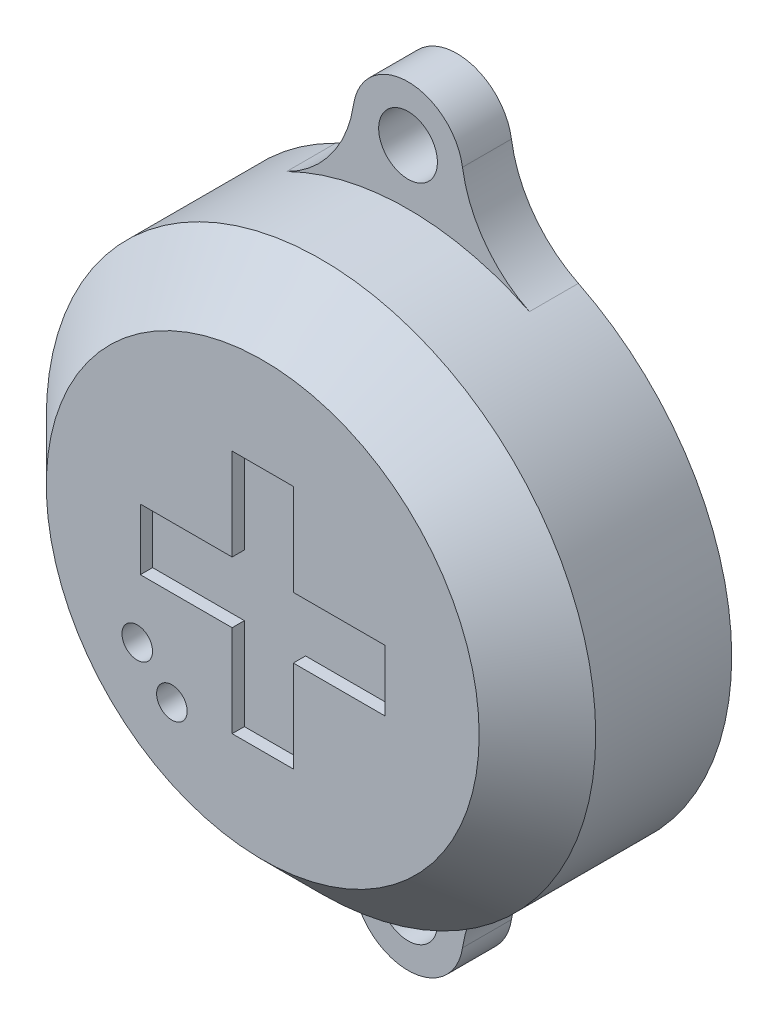
ISO-10303-21;
HEADER;
FILE_DESCRIPTION(('STEP AP214'),'2;1');
FILE_NAME('part.step','',(''),(''),'','','');
FILE_SCHEMA(('AUTOMOTIVE_DESIGN { 1 0 10303 214 1 1 1 1 }'));
ENDSEC;
DATA;
#1=APPLICATION_CONTEXT('core data for automotive mechanical design processes');
#2=APPLICATION_PROTOCOL_DEFINITION('international standard','automotive_design',2000,#1);
#3=PRODUCT_CONTEXT('',#1,'mechanical');
#4=PRODUCT('Part','Part','',(#3));
#5=PRODUCT_RELATED_PRODUCT_CATEGORY('part','',(#4));
#6=PRODUCT_DEFINITION_FORMATION('','',#4);
#7=PRODUCT_DEFINITION_CONTEXT('part definition',#1,'design');
#8=PRODUCT_DEFINITION('design','',#6,#7);
#9=PRODUCT_DEFINITION_SHAPE('','',#8);
#10=(LENGTH_UNIT() NAMED_UNIT(*) SI_UNIT(.MILLI.,.METRE.));
#11=(NAMED_UNIT(*) PLANE_ANGLE_UNIT() SI_UNIT($,.RADIAN.));
#12=(NAMED_UNIT(*) SI_UNIT($,.STERADIAN.) SOLID_ANGLE_UNIT());
#13=UNCERTAINTY_MEASURE_WITH_UNIT(LENGTH_MEASURE(1.E-05),#10,'distance_accuracy_value','');
#14=(GEOMETRIC_REPRESENTATION_CONTEXT(3) GLOBAL_UNCERTAINTY_ASSIGNED_CONTEXT((#13)) GLOBAL_UNIT_ASSIGNED_CONTEXT((#10,
#11,#12)) REPRESENTATION_CONTEXT('',''));
#15=CARTESIAN_POINT('',(0.,0.,0.));
#16=DIRECTION('',(0.,0.,1.));
#17=DIRECTION('',(1.,0.,0.));
#18=AXIS2_PLACEMENT_3D('',#15,#16,#17);
#19=CARTESIAN_POINT('',(0.,0.,0.));
#20=DIRECTION('',(0.,0.,1.));
#21=DIRECTION('',(1.,0.,0.));
#22=AXIS2_PLACEMENT_3D('',#19,#20,#21);
#23=PLANE('',#22);
#24=CARTESIAN_POINT('',(-3.40005801291454E-12,0.,0.));
#25=DIRECTION('',(0.,0.,1.));
#26=DIRECTION('',(1.,0.,0.));
#27=AXIS2_PLACEMENT_3D('',#24,#25,#26);
#28=CIRCLE('',#27,20.45);
#29=CARTESIAN_POINT('',(20.4499999999966,0.,0.));
#30=VERTEX_POINT('',#29);
#31=EDGE_CURVE('E275',#30,#30,#28,.T.);
#32=ORIENTED_EDGE('',*,*,#31,.T.);
#33=EDGE_LOOP('',(#32));
#34=FACE_BOUND('',#33,.T.);
#35=CARTESIAN_POINT('',(-6.8139938136369E-12,26.95,0.));
#36=DIRECTION('',(0.,0.,1.));
#37=DIRECTION('',(1.,0.,0.));
#38=AXIS2_PLACEMENT_3D('',#35,#36,#37);
#39=CIRCLE('',#38,2.40000000000001);
#40=CARTESIAN_POINT('',(2.3999999999932,26.95,0.));
#41=VERTEX_POINT('',#40);
#42=EDGE_CURVE('E353',#41,#41,#39,.T.);
#43=ORIENTED_EDGE('',*,*,#42,.T.);
#44=EDGE_LOOP('',(#43));
#45=FACE_BOUND('',#44,.T.);
#46=CARTESIAN_POINT('',(14.3381419963789,-29.1104823747663,0.));
#47=DIRECTION('',(0.,0.,1.));
#48=DIRECTION('',(1.,0.,0.));
#49=AXIS2_PLACEMENT_3D('',#46,#47,#48);
#50=CIRCLE('',#49,10.);
#51=CARTESIAN_POINT('',(9.91960825327187,-20.1396095320032,0.));
#52=VERTEX_POINT('',#51);
#53=CARTESIAN_POINT('',(4.44976820577276,-27.6204945300999,0.));
#54=VERTEX_POINT('',#53);
#55=EDGE_CURVE('E330',#52,#54,#50,.T.);
#56=ORIENTED_EDGE('',*,*,#55,.T.);
#57=CARTESIAN_POINT('',(0.,-26.95,0.));
#58=DIRECTION('',(0.,0.,1.));
#59=DIRECTION('',(1.,0.,0.));
#60=AXIS2_PLACEMENT_3D('',#57,#58,#59);
#61=CIRCLE('',#60,4.5);
#62=CARTESIAN_POINT('',(-4.44976820577259,-27.620494530101,0.));
#63=VERTEX_POINT('',#62);
#64=EDGE_CURVE('E351',#63,#54,#61,.T.);
#65=ORIENTED_EDGE('',*,*,#64,.F.);
#66=CARTESIAN_POINT('',(-14.3381419963783,-29.1104823747699,0.));
#67=DIRECTION('',(0.,0.,1.));
#68=DIRECTION('',(1.,0.,0.));
#69=AXIS2_PLACEMENT_3D('',#66,#67,#68);
#70=CIRCLE('',#69,10.);
#71=CARTESIAN_POINT('',(-9.91960825327359,-20.1396095320057,0.));
#72=VERTEX_POINT('',#71);
#73=EDGE_CURVE('E348',#63,#72,#70,.T.);
#74=ORIENTED_EDGE('',*,*,#73,.T.);
#75=CARTESIAN_POINT('',(-3.40005801291454E-12,0.,0.));
#76=DIRECTION('',(0.,0.,1.));
#77=DIRECTION('',(1.,0.,0.));
#78=AXIS2_PLACEMENT_3D('',#75,#76,#77);
#79=CIRCLE('',#78,22.45);
#80=CARTESIAN_POINT('',(-9.91960825327869,20.1396095320031,0.));
#81=VERTEX_POINT('',#80);
#82=EDGE_CURVE('E345',#81,#72,#79,.T.);
#83=ORIENTED_EDGE('',*,*,#82,.F.);
#84=CARTESIAN_POINT('',(-14.3381419963857,29.1104823747662,0.));
#85=DIRECTION('',(0.,0.,1.));
#86=DIRECTION('',(1.,0.,0.));
#87=AXIS2_PLACEMENT_3D('',#84,#85,#86);
#88=CIRCLE('',#87,9.99999999999999);
#89=CARTESIAN_POINT('',(-4.44976820577957,27.6204945300999,0.));
#90=VERTEX_POINT('',#89);
#91=EDGE_CURVE('E342',#81,#90,#88,.T.);
#92=ORIENTED_EDGE('',*,*,#91,.T.);
#93=CARTESIAN_POINT('',(-6.8139938136369E-12,26.95,0.));
#94=DIRECTION('',(0.,0.,1.));
#95=DIRECTION('',(1.,0.,0.));
#96=AXIS2_PLACEMENT_3D('',#93,#94,#95);
#97=CIRCLE('',#96,4.5);
#98=CARTESIAN_POINT('',(4.44976820576577,27.620494530101,0.));
#99=VERTEX_POINT('',#98);
#100=EDGE_CURVE('E339',#99,#90,#97,.T.);
#101=ORIENTED_EDGE('',*,*,#100,.F.);
#102=CARTESIAN_POINT('',(14.3381419963715,29.1104823747699,0.));
#103=DIRECTION('',(0.,0.,1.));
#104=DIRECTION('',(1.,0.,0.));
#105=AXIS2_PLACEMENT_3D('',#102,#103,#104);
#106=CIRCLE('',#105,9.99999999999999);
#107=CARTESIAN_POINT('',(9.91960825326677,20.1396095320057,0.));
#108=VERTEX_POINT('',#107);
#109=EDGE_CURVE('E336',#99,#108,#106,.T.);
#110=ORIENTED_EDGE('',*,*,#109,.T.);
#111=CARTESIAN_POINT('',(-3.40005801291454E-12,0.,0.));
#112=DIRECTION('',(0.,0.,1.));
#113=DIRECTION('',(1.,0.,0.));
#114=AXIS2_PLACEMENT_3D('',#111,#112,#113);
#115=CIRCLE('',#114,22.45);
#116=EDGE_CURVE('E333',#52,#108,#115,.T.);
#117=ORIENTED_EDGE('',*,*,#116,.F.);
#118=EDGE_LOOP('',(#56,#65,#74,#83,#92,#101,#110,#117));
#119=FACE_BOUND('',#118,.T.);
#120=CARTESIAN_POINT('',(0.,-26.95,0.));
#121=DIRECTION('',(0.,0.,1.));
#122=DIRECTION('',(1.,0.,0.));
#123=AXIS2_PLACEMENT_3D('',#120,#121,#122);
#124=CIRCLE('',#123,2.40000000000001);
#125=CARTESIAN_POINT('',(2.40000000000002,-26.95,0.));
#126=VERTEX_POINT('',#125);
#127=EDGE_CURVE('E317',#126,#126,#124,.T.);
#128=ORIENTED_EDGE('',*,*,#127,.T.);
#129=EDGE_LOOP('',(#128));
#130=FACE_BOUND('',#129,.T.);
#131=ADVANCED_FACE('F53',(#34,#45,#119,#130),#23,.F.);
#132=CARTESIAN_POINT('',(14.3381419963789,-29.1104823747663,15.875));
#133=DIRECTION('',(0.,0.,-1.));
#134=DIRECTION('',(-1.,0.,0.));
#135=AXIS2_PLACEMENT_3D('',#132,#133,#134);
#136=CYLINDRICAL_SURFACE('',#135,10.);
#137=DIRECTION('',(0.,0.,-1.));
#138=VECTOR('',#137,1.);
#139=CARTESIAN_POINT('',(9.91960825327187,-20.1396095320032,15.875));
#140=LINE('',#139,#138);
#141=CARTESIAN_POINT('',(9.91960825327187,-20.1396095320032,4.));
#142=VERTEX_POINT('',#141);
#143=EDGE_CURVE('E369',#142,#52,#140,.T.);
#144=ORIENTED_EDGE('',*,*,#143,.F.);
#145=CARTESIAN_POINT('',(14.3381419963789,-29.1104823747663,4.));
#146=DIRECTION('',(0.,0.,1.));
#147=DIRECTION('',(1.,0.,0.));
#148=AXIS2_PLACEMENT_3D('',#145,#146,#147);
#149=CIRCLE('',#148,10.);
#150=CARTESIAN_POINT('',(4.44976820577276,-27.6204945300999,4.));
#151=VERTEX_POINT('',#150);
#152=EDGE_CURVE('E311',#151,#142,#149,.F.);
#153=ORIENTED_EDGE('',*,*,#152,.F.);
#154=DIRECTION('',(0.,0.,-1.));
#155=VECTOR('',#154,1.);
#156=CARTESIAN_POINT('',(4.44976820577276,-27.6204945300999,15.875));
#157=LINE('',#156,#155);
#158=EDGE_CURVE('E79',#151,#54,#157,.T.);
#159=ORIENTED_EDGE('',*,*,#158,.T.);
#160=ORIENTED_EDGE('',*,*,#55,.F.);
#161=EDGE_LOOP('',(#144,#153,#159,#160));
#162=FACE_BOUND('',#161,.T.);
#163=ADVANCED_FACE('F415',(#162),#136,.F.);
#164=CARTESIAN_POINT('',(14.3381419963715,29.1104823747699,15.875));
#165=DIRECTION('',(0.,0.,-1.));
#166=DIRECTION('',(-1.,0.,0.));
#167=AXIS2_PLACEMENT_3D('',#164,#165,#166);
#168=CYLINDRICAL_SURFACE('',#167,9.99999999999999);
#169=DIRECTION('',(0.,0.,-1.));
#170=VECTOR('',#169,1.);
#171=CARTESIAN_POINT('',(4.44976820576577,27.620494530101,15.875));
#172=LINE('',#171,#170);
#173=CARTESIAN_POINT('',(4.44976820576577,27.620494530101,4.));
#174=VERTEX_POINT('',#173);
#175=EDGE_CURVE('E365',#174,#99,#172,.T.);
#176=ORIENTED_EDGE('',*,*,#175,.F.);
#177=CARTESIAN_POINT('',(14.3381419963715,29.1104823747699,4.));
#178=DIRECTION('',(0.,0.,1.));
#179=DIRECTION('',(1.,0.,0.));
#180=AXIS2_PLACEMENT_3D('',#177,#178,#179);
#181=CIRCLE('',#180,9.99999999999999);
#182=CARTESIAN_POINT('',(9.91960825326677,20.1396095320057,4.));
#183=VERTEX_POINT('',#182);
#184=EDGE_CURVE('E319',#183,#174,#181,.F.);
#185=ORIENTED_EDGE('',*,*,#184,.F.);
#186=DIRECTION('',(0.,0.,-1.));
#187=VECTOR('',#186,1.);
#188=CARTESIAN_POINT('',(9.91960825326677,20.1396095320057,15.875));
#189=LINE('',#188,#187);
#190=EDGE_CURVE('E367',#183,#108,#189,.T.);
#191=ORIENTED_EDGE('',*,*,#190,.T.);
#192=ORIENTED_EDGE('',*,*,#109,.F.);
#193=EDGE_LOOP('',(#176,#185,#191,#192));
#194=FACE_BOUND('',#193,.T.);
#195=ADVANCED_FACE('F422',(#194),#168,.F.);
#196=CARTESIAN_POINT('',(-6.8139938136369E-12,26.95,15.875));
#197=DIRECTION('',(0.,0.,-1.));
#198=DIRECTION('',(-1.,0.,0.));
#199=AXIS2_PLACEMENT_3D('',#196,#197,#198);
#200=CYLINDRICAL_SURFACE('',#199,4.5);
#201=CARTESIAN_POINT('',(-6.8139938136369E-12,26.95,4.));
#202=DIRECTION('',(0.,0.,1.));
#203=DIRECTION('',(1.,0.,0.));
#204=AXIS2_PLACEMENT_3D('',#201,#202,#203);
#205=CIRCLE('',#204,4.5);
#206=CARTESIAN_POINT('',(-4.44976820577958,27.6204945300999,4.));
#207=VERTEX_POINT('',#206);
#208=EDGE_CURVE('E321',#174,#207,#205,.T.);
#209=ORIENTED_EDGE('',*,*,#208,.F.);
#210=ORIENTED_EDGE('',*,*,#175,.T.);
#211=ORIENTED_EDGE('',*,*,#100,.T.);
#212=DIRECTION('',(0.,0.,-1.));
#213=VECTOR('',#212,1.);
#214=CARTESIAN_POINT('',(-4.44976820577957,27.6204945300999,15.875));
#215=LINE('',#214,#213);
#216=EDGE_CURVE('E363',#207,#90,#215,.T.);
#217=ORIENTED_EDGE('',*,*,#216,.F.);
#218=EDGE_LOOP('',(#209,#210,#211,#217));
#219=FACE_BOUND('',#218,.T.);
#220=ADVANCED_FACE('F444',(#219),#200,.T.);
#221=CARTESIAN_POINT('',(-14.3381419963857,29.1104823747662,15.875));
#222=DIRECTION('',(0.,0.,-1.));
#223=DIRECTION('',(-1.,0.,0.));
#224=AXIS2_PLACEMENT_3D('',#221,#222,#223);
#225=CYLINDRICAL_SURFACE('',#224,9.99999999999999);
#226=DIRECTION('',(0.,0.,-1.));
#227=VECTOR('',#226,1.);
#228=CARTESIAN_POINT('',(-9.91960825327869,20.1396095320031,15.875));
#229=LINE('',#228,#227);
#230=CARTESIAN_POINT('',(-9.91960825327869,20.1396095320031,4.));
#231=VERTEX_POINT('',#230);
#232=EDGE_CURVE('E361',#231,#81,#229,.T.);
#233=ORIENTED_EDGE('',*,*,#232,.F.);
#234=CARTESIAN_POINT('',(-14.3381419963857,29.1104823747662,4.));
#235=DIRECTION('',(0.,0.,1.));
#236=DIRECTION('',(1.,0.,0.));
#237=AXIS2_PLACEMENT_3D('',#234,#235,#236);
#238=CIRCLE('',#237,9.99999999999999);
#239=EDGE_CURVE('E323',#207,#231,#238,.F.);
#240=ORIENTED_EDGE('',*,*,#239,.F.);
#241=ORIENTED_EDGE('',*,*,#216,.T.);
#242=ORIENTED_EDGE('',*,*,#91,.F.);
#243=EDGE_LOOP('',(#233,#240,#241,#242));
#244=FACE_BOUND('',#243,.T.);
#245=ADVANCED_FACE('F438',(#244),#225,.F.);
#246=CARTESIAN_POINT('',(-14.3381419963783,-29.1104823747699,15.875));
#247=DIRECTION('',(0.,0.,-1.));
#248=DIRECTION('',(-1.,0.,0.));
#249=AXIS2_PLACEMENT_3D('',#246,#247,#248);
#250=CYLINDRICAL_SURFACE('',#249,10.);
#251=DIRECTION('',(0.,0.,-1.));
#252=VECTOR('',#251,1.);
#253=CARTESIAN_POINT('',(-4.44976820577259,-27.620494530101,15.875));
#254=LINE('',#253,#252);
#255=CARTESIAN_POINT('',(-4.44976820577259,-27.620494530101,4.));
#256=VERTEX_POINT('',#255);
#257=EDGE_CURVE('E357',#256,#63,#254,.T.);
#258=ORIENTED_EDGE('',*,*,#257,.F.);
#259=CARTESIAN_POINT('',(-14.3381419963783,-29.1104823747699,4.));
#260=DIRECTION('',(0.,0.,1.));
#261=DIRECTION('',(1.,0.,0.));
#262=AXIS2_PLACEMENT_3D('',#259,#260,#261);
#263=CIRCLE('',#262,10.);
#264=CARTESIAN_POINT('',(-9.9196082532736,-20.1396095320057,4.));
#265=VERTEX_POINT('',#264);
#266=EDGE_CURVE('E306',#265,#256,#263,.F.);
#267=ORIENTED_EDGE('',*,*,#266,.F.);
#268=DIRECTION('',(0.,0.,-1.));
#269=VECTOR('',#268,1.);
#270=CARTESIAN_POINT('',(-9.91960825327359,-20.1396095320057,15.875));
#271=LINE('',#270,#269);
#272=EDGE_CURVE('E359',#265,#72,#271,.T.);
#273=ORIENTED_EDGE('',*,*,#272,.T.);
#274=ORIENTED_EDGE('',*,*,#73,.F.);
#275=EDGE_LOOP('',(#258,#267,#273,#274));
#276=FACE_BOUND('',#275,.T.);
#277=ADVANCED_FACE('F434',(#276),#250,.F.);
#278=CARTESIAN_POINT('',(0.,-26.95,15.875));
#279=DIRECTION('',(0.,0.,-1.));
#280=DIRECTION('',(-1.,0.,0.));
#281=AXIS2_PLACEMENT_3D('',#278,#279,#280);
#282=CYLINDRICAL_SURFACE('',#281,4.5);
#283=CARTESIAN_POINT('',(0.,-26.95,4.));
#284=DIRECTION('',(0.,0.,1.));
#285=DIRECTION('',(1.,0.,0.));
#286=AXIS2_PLACEMENT_3D('',#283,#284,#285);
#287=CIRCLE('',#286,4.5);
#288=EDGE_CURVE('E309',#256,#151,#287,.T.);
#289=ORIENTED_EDGE('',*,*,#288,.F.);
#290=ORIENTED_EDGE('',*,*,#257,.T.);
#291=ORIENTED_EDGE('',*,*,#64,.T.);
#292=ORIENTED_EDGE('',*,*,#158,.F.);
#293=EDGE_LOOP('',(#289,#290,#291,#292));
#294=FACE_BOUND('',#293,.T.);
#295=ADVANCED_FACE('F431',(#294),#282,.T.);
#296=CARTESIAN_POINT('',(0.,-26.95,15.875));
#297=DIRECTION('',(0.,0.,-1.));
#298=DIRECTION('',(-1.,0.,0.));
#299=AXIS2_PLACEMENT_3D('',#296,#297,#298);
#300=CYLINDRICAL_SURFACE('',#299,2.40000000000001);
#301=ORIENTED_EDGE('',*,*,#127,.F.);
#302=EDGE_LOOP('',(#301));
#303=FACE_BOUND('',#302,.T.);
#304=CARTESIAN_POINT('',(0.,-26.95,4.));
#305=DIRECTION('',(0.,0.,1.));
#306=DIRECTION('',(1.,0.,0.));
#307=AXIS2_PLACEMENT_3D('',#304,#305,#306);
#308=CIRCLE('',#307,2.40000000000001);
#309=CARTESIAN_POINT('',(2.40000000000002,-26.95,4.));
#310=VERTEX_POINT('',#309);
#311=EDGE_CURVE('E314',#310,#310,#308,.F.);
#312=ORIENTED_EDGE('',*,*,#311,.F.);
#313=EDGE_LOOP('',(#312));
#314=FACE_BOUND('',#313,.T.);
#315=ADVANCED_FACE('F429',(#303,#314),#300,.F.);
#316=CARTESIAN_POINT('',(-6.8139938136369E-12,26.95,15.875));
#317=DIRECTION('',(0.,0.,-1.));
#318=DIRECTION('',(-1.,0.,0.));
#319=AXIS2_PLACEMENT_3D('',#316,#317,#318);
#320=CYLINDRICAL_SURFACE('',#319,2.40000000000001);
#321=ORIENTED_EDGE('',*,*,#42,.F.);
#322=EDGE_LOOP('',(#321));
#323=FACE_BOUND('',#322,.T.);
#324=CARTESIAN_POINT('',(-6.8139938136369E-12,26.95,4.));
#325=DIRECTION('',(0.,0.,1.));
#326=DIRECTION('',(1.,0.,0.));
#327=AXIS2_PLACEMENT_3D('',#324,#325,#326);
#328=CIRCLE('',#327,2.40000000000001);
#329=CARTESIAN_POINT('',(2.3999999999932,26.95,4.));
#330=VERTEX_POINT('',#329);
#331=EDGE_CURVE('E307',#330,#330,#328,.F.);
#332=ORIENTED_EDGE('',*,*,#331,.F.);
#333=EDGE_LOOP('',(#332));
#334=FACE_BOUND('',#333,.T.);
#335=ADVANCED_FACE('F391',(#323,#334),#320,.F.);
#336=CARTESIAN_POINT('',(0.,0.,15.875));
#337=DIRECTION('',(0.,0.,1.));
#338=DIRECTION('',(1.,0.,0.));
#339=AXIS2_PLACEMENT_3D('',#336,#337,#338);
#340=PLANE('',#339);
#341=CARTESIAN_POINT('',(-7.42462120245873,-10.253048327205,15.875));
#342=DIRECTION('',(0.,0.,1.));
#343=DIRECTION('',(1.,0.,0.));
#344=AXIS2_PLACEMENT_3D('',#341,#342,#343);
#345=CIRCLE('',#344,1.25);
#346=CARTESIAN_POINT('',(-6.17462120245873,-10.253048327205,15.875));
#347=VERTEX_POINT('',#346);
#348=EDGE_CURVE('E374',#347,#347,#345,.T.);
#349=ORIENTED_EDGE('',*,*,#348,.F.);
#350=EDGE_LOOP('',(#349));
#351=FACE_BOUND('',#350,.T.);
#352=CARTESIAN_POINT('',(-10.2530483272049,-7.42462120245877,15.875));
#353=DIRECTION('',(0.,0.,1.));
#354=DIRECTION('',(1.,0.,0.));
#355=AXIS2_PLACEMENT_3D('',#352,#353,#354);
#356=CIRCLE('',#355,1.25);
#357=CARTESIAN_POINT('',(-9.00304832720492,-7.42462120245877,15.875));
#358=VERTEX_POINT('',#357);
#359=EDGE_CURVE('E221',#358,#358,#356,.T.);
#360=ORIENTED_EDGE('',*,*,#359,.F.);
#361=EDGE_LOOP('',(#360));
#362=FACE_BOUND('',#361,.T.);
#363=DIRECTION('',(0.,-1.,0.));
#364=VECTOR('',#363,1.);
#365=CARTESIAN_POINT('',(-10.,0.,15.875));
#366=LINE('',#365,#364);
#367=CARTESIAN_POINT('',(-10.,2.5,15.875));
#368=VERTEX_POINT('',#367);
#369=CARTESIAN_POINT('',(-10.,-2.5,15.875));
#370=VERTEX_POINT('',#369);
#371=EDGE_CURVE('E71',#368,#370,#366,.T.);
#372=ORIENTED_EDGE('',*,*,#371,.F.);
#373=DIRECTION('',(1.,0.,0.));
#374=VECTOR('',#373,1.);
#375=CARTESIAN_POINT('',(0.,2.5,15.875));
#376=LINE('',#375,#374);
#377=CARTESIAN_POINT('',(-2.5,2.5,15.875));
#378=VERTEX_POINT('',#377);
#379=EDGE_CURVE('E215',#368,#378,#376,.T.);
#380=ORIENTED_EDGE('',*,*,#379,.T.);
#381=DIRECTION('',(0.,-1.,0.));
#382=VECTOR('',#381,1.);
#383=CARTESIAN_POINT('',(-2.5,0.,15.875));
#384=LINE('',#383,#382);
#385=CARTESIAN_POINT('',(-2.5,10.,15.875));
#386=VERTEX_POINT('',#385);
#387=EDGE_CURVE('E218',#386,#378,#384,.T.);
#388=ORIENTED_EDGE('',*,*,#387,.F.);
#389=DIRECTION('',(1.,0.,0.));
#390=VECTOR('',#389,1.);
#391=CARTESIAN_POINT('',(0.,10.,15.875));
#392=LINE('',#391,#390);
#393=CARTESIAN_POINT('',(2.5,10.,15.875));
#394=VERTEX_POINT('',#393);
#395=EDGE_CURVE('E268',#386,#394,#392,.T.);
#396=ORIENTED_EDGE('',*,*,#395,.T.);
#397=DIRECTION('',(0.,-1.,0.));
#398=VECTOR('',#397,1.);
#399=CARTESIAN_POINT('',(2.5,0.,15.875));
#400=LINE('',#399,#398);
#401=CARTESIAN_POINT('',(2.5,2.5,15.875));
#402=VERTEX_POINT('',#401);
#403=EDGE_CURVE('E265',#394,#402,#400,.T.);
#404=ORIENTED_EDGE('',*,*,#403,.T.);
#405=DIRECTION('',(1.,0.,0.));
#406=VECTOR('',#405,1.);
#407=CARTESIAN_POINT('',(0.,2.5,15.875));
#408=LINE('',#407,#406);
#409=CARTESIAN_POINT('',(10.,2.5,15.875));
#410=VERTEX_POINT('',#409);
#411=EDGE_CURVE('E262',#402,#410,#408,.T.);
#412=ORIENTED_EDGE('',*,*,#411,.T.);
#413=DIRECTION('',(0.,-1.,0.));
#414=VECTOR('',#413,1.);
#415=CARTESIAN_POINT('',(10.,0.,15.875));
#416=LINE('',#415,#414);
#417=CARTESIAN_POINT('',(10.,-2.5,15.875));
#418=VERTEX_POINT('',#417);
#419=EDGE_CURVE('E259',#410,#418,#416,.T.);
#420=ORIENTED_EDGE('',*,*,#419,.T.);
#421=DIRECTION('',(1.,0.,0.));
#422=VECTOR('',#421,1.);
#423=CARTESIAN_POINT('',(0.,-2.5,15.875));
#424=LINE('',#423,#422);
#425=CARTESIAN_POINT('',(2.5,-2.5,15.875));
#426=VERTEX_POINT('',#425);
#427=EDGE_CURVE('E256',#426,#418,#424,.T.);
#428=ORIENTED_EDGE('',*,*,#427,.F.);
#429=DIRECTION('',(0.,-1.,0.));
#430=VECTOR('',#429,1.);
#431=CARTESIAN_POINT('',(2.5,0.,15.875));
#432=LINE('',#431,#430);
#433=CARTESIAN_POINT('',(2.5,-10.,15.875));
#434=VERTEX_POINT('',#433);
#435=EDGE_CURVE('E253',#426,#434,#432,.T.);
#436=ORIENTED_EDGE('',*,*,#435,.T.);
#437=DIRECTION('',(1.,0.,0.));
#438=VECTOR('',#437,1.);
#439=CARTESIAN_POINT('',(0.,-10.,15.875));
#440=LINE('',#439,#438);
#441=CARTESIAN_POINT('',(-2.5,-10.,15.875));
#442=VERTEX_POINT('',#441);
#443=EDGE_CURVE('E250',#442,#434,#440,.T.);
#444=ORIENTED_EDGE('',*,*,#443,.F.);
#445=DIRECTION('',(0.,-1.,0.));
#446=VECTOR('',#445,1.);
#447=CARTESIAN_POINT('',(-2.5,0.,15.875));
#448=LINE('',#447,#446);
#449=CARTESIAN_POINT('',(-2.5,-2.5,15.875));
#450=VERTEX_POINT('',#449);
#451=EDGE_CURVE('E247',#450,#442,#448,.T.);
#452=ORIENTED_EDGE('',*,*,#451,.F.);
#453=DIRECTION('',(1.,0.,0.));
#454=VECTOR('',#453,1.);
#455=CARTESIAN_POINT('',(0.,-2.5,15.875));
#456=LINE('',#455,#454);
#457=EDGE_CURVE('E245',#370,#450,#456,.T.);
#458=ORIENTED_EDGE('',*,*,#457,.F.);
#459=EDGE_LOOP('',(#372,#380,#388,#396,#404,#412,#420,#428,#436,#444,#452,#458));
#460=FACE_BOUND('',#459,.T.);
#461=CARTESIAN_POINT('',(-3.40005801291454E-12,0.,15.875));
#462=DIRECTION('',(0.,0.,1.));
#463=DIRECTION('',(1.,0.,0.));
#464=AXIS2_PLACEMENT_3D('',#461,#462,#463);
#465=CIRCLE('',#464,17.6875);
#466=CARTESIAN_POINT('',(17.6874999999966,0.,15.875));
#467=VERTEX_POINT('',#466);
#468=EDGE_CURVE('E63',#467,#467,#465,.T.);
#469=ORIENTED_EDGE('',*,*,#468,.T.);
#470=EDGE_LOOP('',(#469));
#471=FACE_BOUND('',#470,.T.);
#472=ADVANCED_FACE('F387',(#351,#362,#460,#471),#340,.T.);
#473=CARTESIAN_POINT('',(-3.40005801291454E-12,0.,15.875));
#474=DIRECTION('',(0.,0.,-1.));
#475=DIRECTION('',(-1.,0.,0.));
#476=AXIS2_PLACEMENT_3D('',#473,#474,#475);
#477=CYLINDRICAL_SURFACE('',#476,22.45);
#478=CARTESIAN_POINT('',(-3.40005801291454E-12,0.,11.1125));
#479=DIRECTION('',(0.,0.,1.));
#480=DIRECTION('',(1.,0.,0.));
#481=AXIS2_PLACEMENT_3D('',#478,#479,#480);
#482=CIRCLE('',#481,22.45);
#483=CARTESIAN_POINT('',(22.4499999999966,0.,11.1125));
#484=VERTEX_POINT('',#483);
#485=EDGE_CURVE('E11',#484,#484,#482,.F.);
#486=ORIENTED_EDGE('',*,*,#485,.T.);
#487=EDGE_LOOP('',(#486));
#488=FACE_BOUND('',#487,.T.);
#489=CARTESIAN_POINT('',(-3.40005801291454E-12,0.,4.));
#490=DIRECTION('',(0.,0.,1.));
#491=DIRECTION('',(1.,0.,0.));
#492=AXIS2_PLACEMENT_3D('',#489,#490,#491);
#493=CIRCLE('',#492,22.45);
#494=EDGE_CURVE('E304',#265,#142,#493,.T.);
#495=ORIENTED_EDGE('',*,*,#494,.T.);
#496=ORIENTED_EDGE('',*,*,#143,.T.);
#497=ORIENTED_EDGE('',*,*,#116,.T.);
#498=ORIENTED_EDGE('',*,*,#190,.F.);
#499=CARTESIAN_POINT('',(-3.40005801291454E-12,0.,4.));
#500=DIRECTION('',(0.,0.,1.));
#501=DIRECTION('',(1.,0.,0.));
#502=AXIS2_PLACEMENT_3D('',#499,#500,#501);
#503=CIRCLE('',#502,22.45);
#504=EDGE_CURVE('E298',#183,#231,#503,.T.);
#505=ORIENTED_EDGE('',*,*,#504,.T.);
#506=ORIENTED_EDGE('',*,*,#232,.T.);
#507=ORIENTED_EDGE('',*,*,#82,.T.);
#508=ORIENTED_EDGE('',*,*,#272,.F.);
#509=EDGE_LOOP('',(#495,#496,#497,#498,#505,#506,#507,#508));
#510=FACE_BOUND('',#509,.T.);
#511=ADVANCED_FACE('F390',(#488,#510),#477,.T.);
#512=CARTESIAN_POINT('',(0.,0.,4.));
#513=DIRECTION('',(0.,0.,1.));
#514=DIRECTION('',(1.,0.,0.));
#515=AXIS2_PLACEMENT_3D('',#512,#513,#514);
#516=PLANE('',#515);
#517=ORIENTED_EDGE('',*,*,#504,.F.);
#518=ORIENTED_EDGE('',*,*,#184,.T.);
#519=ORIENTED_EDGE('',*,*,#208,.T.);
#520=ORIENTED_EDGE('',*,*,#239,.T.);
#521=EDGE_LOOP('',(#517,#518,#519,#520));
#522=FACE_BOUND('',#521,.T.);
#523=ORIENTED_EDGE('',*,*,#331,.T.);
#524=EDGE_LOOP('',(#523));
#525=FACE_BOUND('',#524,.T.);
#526=ADVANCED_FACE('F410',(#522,#525),#516,.T.);
#527=CARTESIAN_POINT('',(0.,0.,4.));
#528=DIRECTION('',(0.,0.,1.));
#529=DIRECTION('',(1.,0.,0.));
#530=AXIS2_PLACEMENT_3D('',#527,#528,#529);
#531=PLANE('',#530);
#532=ORIENTED_EDGE('',*,*,#494,.F.);
#533=ORIENTED_EDGE('',*,*,#266,.T.);
#534=ORIENTED_EDGE('',*,*,#288,.T.);
#535=ORIENTED_EDGE('',*,*,#152,.T.);
#536=EDGE_LOOP('',(#532,#533,#534,#535));
#537=FACE_BOUND('',#536,.T.);
#538=ORIENTED_EDGE('',*,*,#311,.T.);
#539=EDGE_LOOP('',(#538));
#540=FACE_BOUND('',#539,.T.);
#541=ADVANCED_FACE('F399',(#537,#540),#531,.T.);
#542=CARTESIAN_POINT('',(-3.40005801291454E-12,0.,15.875));
#543=DIRECTION('',(0.,0.,-1.));
#544=DIRECTION('',(-1.,0.,0.));
#545=AXIS2_PLACEMENT_3D('',#542,#543,#544);
#546=CONICAL_SURFACE('',#545,17.6875,0.785398163397446);
#547=ORIENTED_EDGE('',*,*,#485,.F.);
#548=EDGE_LOOP('',(#547));
#549=FACE_BOUND('',#548,.T.);
#550=ORIENTED_EDGE('',*,*,#468,.F.);
#551=EDGE_LOOP('',(#550));
#552=FACE_BOUND('',#551,.T.);
#553=ADVANCED_FACE('F56',(#549,#552),#546,.T.);
#554=CARTESIAN_POINT('',(0.,0.,13.875));
#555=DIRECTION('',(0.,0.,1.));
#556=DIRECTION('',(1.,0.,0.));
#557=AXIS2_PLACEMENT_3D('',#554,#555,#556);
#558=PLANE('',#557);
#559=CARTESIAN_POINT('',(-7.42462120245873,-10.253048327205,13.875));
#560=DIRECTION('',(0.,0.,1.));
#561=DIRECTION('',(1.,0.,0.));
#562=AXIS2_PLACEMENT_3D('',#559,#560,#561);
#563=CIRCLE('',#562,1.25);
#564=CARTESIAN_POINT('',(-6.17462120245873,-10.253048327205,13.875));
#565=VERTEX_POINT('',#564);
#566=EDGE_CURVE('E58',#565,#565,#563,.T.);
#567=ORIENTED_EDGE('',*,*,#566,.T.);
#568=EDGE_LOOP('',(#567));
#569=FACE_BOUND('',#568,.T.);
#570=CARTESIAN_POINT('',(-10.2530483272049,-7.42462120245877,13.875));
#571=DIRECTION('',(0.,0.,1.));
#572=DIRECTION('',(1.,0.,0.));
#573=AXIS2_PLACEMENT_3D('',#570,#571,#572);
#574=CIRCLE('',#573,1.25);
#575=CARTESIAN_POINT('',(-9.00304832720492,-7.42462120245877,13.875));
#576=VERTEX_POINT('',#575);
#577=EDGE_CURVE('E372',#576,#576,#574,.T.);
#578=ORIENTED_EDGE('',*,*,#577,.T.);
#579=EDGE_LOOP('',(#578));
#580=FACE_BOUND('',#579,.T.);
#581=CARTESIAN_POINT('',(-3.40005801291454E-12,0.,13.875));
#582=DIRECTION('',(0.,0.,1.));
#583=DIRECTION('',(1.,0.,0.));
#584=AXIS2_PLACEMENT_3D('',#581,#582,#583);
#585=CIRCLE('',#584,16.8590728752538);
#586=CARTESIAN_POINT('',(16.8590728752504,0.,13.875));
#587=VERTEX_POINT('',#586);
#588=EDGE_CURVE('E299',#587,#587,#585,.T.);
#589=ORIENTED_EDGE('',*,*,#588,.F.);
#590=EDGE_LOOP('',(#589));
#591=FACE_BOUND('',#590,.T.);
#592=ADVANCED_FACE('F398',(#569,#580,#591),#558,.F.);
#593=CARTESIAN_POINT('',(-3.40005801291454E-12,0.,15.875));
#594=DIRECTION('',(0.,0.,-1.));
#595=DIRECTION('',(-1.,0.,0.));
#596=AXIS2_PLACEMENT_3D('',#593,#594,#595);
#597=CYLINDRICAL_SURFACE('',#596,20.45);
#598=ORIENTED_EDGE('',*,*,#31,.F.);
#599=EDGE_LOOP('',(#598));
#600=FACE_BOUND('',#599,.T.);
#601=CARTESIAN_POINT('',(-3.40005801291454E-12,0.,10.2840728752538));
#602=DIRECTION('',(0.,0.,-1.));
#603=DIRECTION('',(-1.,0.,0.));
#604=AXIS2_PLACEMENT_3D('',#601,#602,#603);
#605=CIRCLE('',#604,20.45);
#606=CARTESIAN_POINT('',(-20.4500000000034,0.,10.2840728752538));
#607=VERTEX_POINT('',#606);
#608=EDGE_CURVE('E295',#607,#607,#605,.T.);
#609=ORIENTED_EDGE('',*,*,#608,.F.);
#610=EDGE_LOOP('',(#609));
#611=FACE_BOUND('',#610,.T.);
#612=ADVANCED_FACE('F406',(#600,#611),#597,.F.);
#613=CARTESIAN_POINT('',(-3.40005801291454E-12,0.,14.4607864376269));
#614=DIRECTION('',(0.,0.,-1.));
#615=DIRECTION('',(-1.,0.,0.));
#616=AXIS2_PLACEMENT_3D('',#613,#614,#615);
#617=CONICAL_SURFACE('',#616,16.2732864376269,0.785398163397446);
#618=ORIENTED_EDGE('',*,*,#608,.T.);
#619=EDGE_LOOP('',(#618));
#620=FACE_BOUND('',#619,.T.);
#621=ORIENTED_EDGE('',*,*,#588,.T.);
#622=EDGE_LOOP('',(#621));
#623=FACE_BOUND('',#622,.T.);
#624=ADVANCED_FACE('F676',(#620,#623),#617,.F.);
#625=CARTESIAN_POINT('',(-10.,0.,14.875));
#626=DIRECTION('',(-1.,0.,0.));
#627=DIRECTION('',(0.,-1.,0.));
#628=AXIS2_PLACEMENT_3D('',#625,#626,#627);
#629=PLANE('',#628);
#630=ORIENTED_EDGE('',*,*,#371,.T.);
#631=DIRECTION('',(0.,0.,1.));
#632=VECTOR('',#631,1.);
#633=CARTESIAN_POINT('',(-10.,-2.5,14.875));
#634=LINE('',#633,#632);
#635=CARTESIAN_POINT('',(-10.,-2.5,14.875));
#636=VERTEX_POINT('',#635);
#637=EDGE_CURVE('E193',#636,#370,#634,.T.);
#638=ORIENTED_EDGE('',*,*,#637,.F.);
#639=DIRECTION('',(0.,-1.,0.));
#640=VECTOR('',#639,1.);
#641=CARTESIAN_POINT('',(-10.,0.,14.875));
#642=LINE('',#641,#640);
#643=CARTESIAN_POINT('',(-10.,2.5,14.875));
#644=VERTEX_POINT('',#643);
#645=EDGE_CURVE('E197',#644,#636,#642,.T.);
#646=ORIENTED_EDGE('',*,*,#645,.F.);
#647=DIRECTION('',(0.,0.,1.));
#648=VECTOR('',#647,1.);
#649=CARTESIAN_POINT('',(-10.,2.5,14.875));
#650=LINE('',#649,#648);
#651=EDGE_CURVE('E273',#644,#368,#650,.T.);
#652=ORIENTED_EDGE('',*,*,#651,.T.);
#653=EDGE_LOOP('',(#630,#638,#646,#652));
#654=FACE_BOUND('',#653,.T.);
#655=ADVANCED_FACE('F195',(#654),#629,.F.);
#656=CARTESIAN_POINT('',(0.,2.5,14.875));
#657=DIRECTION('',(0.,-1.,0.));
#658=DIRECTION('',(0.,0.,-1.));
#659=AXIS2_PLACEMENT_3D('',#656,#657,#658);
#660=PLANE('',#659);
#661=ORIENTED_EDGE('',*,*,#379,.F.);
#662=ORIENTED_EDGE('',*,*,#651,.F.);
#663=DIRECTION('',(1.,0.,0.));
#664=VECTOR('',#663,1.);
#665=CARTESIAN_POINT('',(0.,2.5,14.875));
#666=LINE('',#665,#664);
#667=CARTESIAN_POINT('',(-2.5,2.5,14.875));
#668=VERTEX_POINT('',#667);
#669=EDGE_CURVE('E202',#644,#668,#666,.T.);
#670=ORIENTED_EDGE('',*,*,#669,.T.);
#671=DIRECTION('',(0.,0.,1.));
#672=VECTOR('',#671,1.);
#673=CARTESIAN_POINT('',(-2.5,2.5,14.875));
#674=LINE('',#673,#672);
#675=EDGE_CURVE('E276',#668,#378,#674,.T.);
#676=ORIENTED_EDGE('',*,*,#675,.T.);
#677=EDGE_LOOP('',(#661,#662,#670,#676));
#678=FACE_BOUND('',#677,.T.);
#679=ADVANCED_FACE('F659',(#678),#660,.T.);
#680=CARTESIAN_POINT('',(-2.5,0.,14.875));
#681=DIRECTION('',(-1.,0.,0.));
#682=DIRECTION('',(0.,-1.,0.));
#683=AXIS2_PLACEMENT_3D('',#680,#681,#682);
#684=PLANE('',#683);
#685=ORIENTED_EDGE('',*,*,#387,.T.);
#686=ORIENTED_EDGE('',*,*,#675,.F.);
#687=DIRECTION('',(0.,-1.,0.));
#688=VECTOR('',#687,1.);
#689=CARTESIAN_POINT('',(-2.5,0.,14.875));
#690=LINE('',#689,#688);
#691=CARTESIAN_POINT('',(-2.5,10.,14.875));
#692=VERTEX_POINT('',#691);
#693=EDGE_CURVE('E241',#692,#668,#690,.T.);
#694=ORIENTED_EDGE('',*,*,#693,.F.);
#695=DIRECTION('',(0.,0.,1.));
#696=VECTOR('',#695,1.);
#697=CARTESIAN_POINT('',(-2.5,10.,14.875));
#698=LINE('',#697,#696);
#699=EDGE_CURVE('E278',#692,#386,#698,.T.);
#700=ORIENTED_EDGE('',*,*,#699,.T.);
#701=EDGE_LOOP('',(#685,#686,#694,#700));
#702=FACE_BOUND('',#701,.T.);
#703=ADVANCED_FACE('F650',(#702),#684,.F.);
#704=CARTESIAN_POINT('',(0.,10.,14.875));
#705=DIRECTION('',(0.,-1.,0.));
#706=DIRECTION('',(0.,0.,-1.));
#707=AXIS2_PLACEMENT_3D('',#704,#705,#706);
#708=PLANE('',#707);
#709=ORIENTED_EDGE('',*,*,#395,.F.);
#710=ORIENTED_EDGE('',*,*,#699,.F.);
#711=DIRECTION('',(1.,0.,0.));
#712=VECTOR('',#711,1.);
#713=CARTESIAN_POINT('',(0.,10.,14.875));
#714=LINE('',#713,#712);
#715=CARTESIAN_POINT('',(2.5,10.,14.875));
#716=VERTEX_POINT('',#715);
#717=EDGE_CURVE('E239',#692,#716,#714,.T.);
#718=ORIENTED_EDGE('',*,*,#717,.T.);
#719=DIRECTION('',(0.,0.,1.));
#720=VECTOR('',#719,1.);
#721=CARTESIAN_POINT('',(2.5,10.,14.875));
#722=LINE('',#721,#720);
#723=EDGE_CURVE('E280',#716,#394,#722,.T.);
#724=ORIENTED_EDGE('',*,*,#723,.T.);
#725=EDGE_LOOP('',(#709,#710,#718,#724));
#726=FACE_BOUND('',#725,.T.);
#727=ADVANCED_FACE('F641',(#726),#708,.T.);
#728=CARTESIAN_POINT('',(2.5,0.,14.875));
#729=DIRECTION('',(-1.,0.,0.));
#730=DIRECTION('',(0.,-1.,0.));
#731=AXIS2_PLACEMENT_3D('',#728,#729,#730);
#732=PLANE('',#731);
#733=ORIENTED_EDGE('',*,*,#403,.F.);
#734=ORIENTED_EDGE('',*,*,#723,.F.);
#735=DIRECTION('',(0.,-1.,0.));
#736=VECTOR('',#735,1.);
#737=CARTESIAN_POINT('',(2.5,0.,14.875));
#738=LINE('',#737,#736);
#739=CARTESIAN_POINT('',(2.5,2.5,14.875));
#740=VERTEX_POINT('',#739);
#741=EDGE_CURVE('E237',#716,#740,#738,.T.);
#742=ORIENTED_EDGE('',*,*,#741,.T.);
#743=DIRECTION('',(0.,0.,1.));
#744=VECTOR('',#743,1.);
#745=CARTESIAN_POINT('',(2.5,2.5,14.875));
#746=LINE('',#745,#744);
#747=EDGE_CURVE('E282',#740,#402,#746,.T.);
#748=ORIENTED_EDGE('',*,*,#747,.T.);
#749=EDGE_LOOP('',(#733,#734,#742,#748));
#750=FACE_BOUND('',#749,.T.);
#751=ADVANCED_FACE('F632',(#750),#732,.T.);
#752=CARTESIAN_POINT('',(0.,2.5,14.875));
#753=DIRECTION('',(0.,-1.,0.));
#754=DIRECTION('',(0.,0.,-1.));
#755=AXIS2_PLACEMENT_3D('',#752,#753,#754);
#756=PLANE('',#755);
#757=ORIENTED_EDGE('',*,*,#411,.F.);
#758=ORIENTED_EDGE('',*,*,#747,.F.);
#759=DIRECTION('',(1.,0.,0.));
#760=VECTOR('',#759,1.);
#761=CARTESIAN_POINT('',(0.,2.5,14.875));
#762=LINE('',#761,#760);
#763=CARTESIAN_POINT('',(10.,2.5,14.875));
#764=VERTEX_POINT('',#763);
#765=EDGE_CURVE('E235',#740,#764,#762,.T.);
#766=ORIENTED_EDGE('',*,*,#765,.T.);
#767=DIRECTION('',(0.,0.,1.));
#768=VECTOR('',#767,1.);
#769=CARTESIAN_POINT('',(10.,2.5,14.875));
#770=LINE('',#769,#768);
#771=EDGE_CURVE('E284',#764,#410,#770,.T.);
#772=ORIENTED_EDGE('',*,*,#771,.T.);
#773=EDGE_LOOP('',(#757,#758,#766,#772));
#774=FACE_BOUND('',#773,.T.);
#775=ADVANCED_FACE('F623',(#774),#756,.T.);
#776=CARTESIAN_POINT('',(10.,0.,14.875));
#777=DIRECTION('',(-1.,0.,0.));
#778=DIRECTION('',(0.,-1.,0.));
#779=AXIS2_PLACEMENT_3D('',#776,#777,#778);
#780=PLANE('',#779);
#781=ORIENTED_EDGE('',*,*,#419,.F.);
#782=ORIENTED_EDGE('',*,*,#771,.F.);
#783=DIRECTION('',(0.,-1.,0.));
#784=VECTOR('',#783,1.);
#785=CARTESIAN_POINT('',(10.,0.,14.875));
#786=LINE('',#785,#784);
#787=CARTESIAN_POINT('',(10.,-2.5,14.875));
#788=VERTEX_POINT('',#787);
#789=EDGE_CURVE('E233',#764,#788,#786,.T.);
#790=ORIENTED_EDGE('',*,*,#789,.T.);
#791=DIRECTION('',(0.,0.,1.));
#792=VECTOR('',#791,1.);
#793=CARTESIAN_POINT('',(10.,-2.5,14.875));
#794=LINE('',#793,#792);
#795=EDGE_CURVE('E286',#788,#418,#794,.T.);
#796=ORIENTED_EDGE('',*,*,#795,.T.);
#797=EDGE_LOOP('',(#781,#782,#790,#796));
#798=FACE_BOUND('',#797,.T.);
#799=ADVANCED_FACE('F614',(#798),#780,.T.);
#800=CARTESIAN_POINT('',(0.,-2.5,14.875));
#801=DIRECTION('',(0.,-1.,0.));
#802=DIRECTION('',(0.,0.,-1.));
#803=AXIS2_PLACEMENT_3D('',#800,#801,#802);
#804=PLANE('',#803);
#805=ORIENTED_EDGE('',*,*,#427,.T.);
#806=ORIENTED_EDGE('',*,*,#795,.F.);
#807=DIRECTION('',(1.,0.,0.));
#808=VECTOR('',#807,1.);
#809=CARTESIAN_POINT('',(0.,-2.5,14.875));
#810=LINE('',#809,#808);
#811=CARTESIAN_POINT('',(2.5,-2.5,14.875));
#812=VERTEX_POINT('',#811);
#813=EDGE_CURVE('E230',#812,#788,#810,.T.);
#814=ORIENTED_EDGE('',*,*,#813,.F.);
#815=DIRECTION('',(0.,0.,1.));
#816=VECTOR('',#815,1.);
#817=CARTESIAN_POINT('',(2.5,-2.5,14.875));
#818=LINE('',#817,#816);
#819=EDGE_CURVE('E288',#812,#426,#818,.T.);
#820=ORIENTED_EDGE('',*,*,#819,.T.);
#821=EDGE_LOOP('',(#805,#806,#814,#820));
#822=FACE_BOUND('',#821,.T.);
#823=ADVANCED_FACE('F605',(#822),#804,.F.);
#824=CARTESIAN_POINT('',(2.5,0.,14.875));
#825=DIRECTION('',(-1.,0.,0.));
#826=DIRECTION('',(0.,-1.,0.));
#827=AXIS2_PLACEMENT_3D('',#824,#825,#826);
#828=PLANE('',#827);
#829=ORIENTED_EDGE('',*,*,#435,.F.);
#830=ORIENTED_EDGE('',*,*,#819,.F.);
#831=DIRECTION('',(0.,-1.,0.));
#832=VECTOR('',#831,1.);
#833=CARTESIAN_POINT('',(2.5,0.,14.875));
#834=LINE('',#833,#832);
#835=CARTESIAN_POINT('',(2.5,-10.,14.875));
#836=VERTEX_POINT('',#835);
#837=EDGE_CURVE('E228',#812,#836,#834,.T.);
#838=ORIENTED_EDGE('',*,*,#837,.T.);
#839=DIRECTION('',(0.,0.,1.));
#840=VECTOR('',#839,1.);
#841=CARTESIAN_POINT('',(2.5,-10.,14.875));
#842=LINE('',#841,#840);
#843=EDGE_CURVE('E290',#836,#434,#842,.T.);
#844=ORIENTED_EDGE('',*,*,#843,.T.);
#845=EDGE_LOOP('',(#829,#830,#838,#844));
#846=FACE_BOUND('',#845,.T.);
#847=ADVANCED_FACE('F596',(#846),#828,.T.);
#848=CARTESIAN_POINT('',(0.,-10.,14.875));
#849=DIRECTION('',(0.,-1.,0.));
#850=DIRECTION('',(0.,0.,-1.));
#851=AXIS2_PLACEMENT_3D('',#848,#849,#850);
#852=PLANE('',#851);
#853=ORIENTED_EDGE('',*,*,#443,.T.);
#854=ORIENTED_EDGE('',*,*,#843,.F.);
#855=DIRECTION('',(1.,0.,0.));
#856=VECTOR('',#855,1.);
#857=CARTESIAN_POINT('',(0.,-10.,14.875));
#858=LINE('',#857,#856);
#859=CARTESIAN_POINT('',(-2.5,-10.,14.875));
#860=VERTEX_POINT('',#859);
#861=EDGE_CURVE('E225',#860,#836,#858,.T.);
#862=ORIENTED_EDGE('',*,*,#861,.F.);
#863=DIRECTION('',(0.,0.,1.));
#864=VECTOR('',#863,1.);
#865=CARTESIAN_POINT('',(-2.5,-10.,14.875));
#866=LINE('',#865,#864);
#867=EDGE_CURVE('E292',#860,#442,#866,.T.);
#868=ORIENTED_EDGE('',*,*,#867,.T.);
#869=EDGE_LOOP('',(#853,#854,#862,#868));
#870=FACE_BOUND('',#869,.T.);
#871=ADVANCED_FACE('F587',(#870),#852,.F.);
#872=CARTESIAN_POINT('',(-2.5,0.,14.875));
#873=DIRECTION('',(-1.,0.,0.));
#874=DIRECTION('',(0.,-1.,0.));
#875=AXIS2_PLACEMENT_3D('',#872,#873,#874);
#876=PLANE('',#875);
#877=ORIENTED_EDGE('',*,*,#451,.T.);
#878=ORIENTED_EDGE('',*,*,#867,.F.);
#879=DIRECTION('',(0.,-1.,0.));
#880=VECTOR('',#879,1.);
#881=CARTESIAN_POINT('',(-2.5,0.,14.875));
#882=LINE('',#881,#880);
#883=CARTESIAN_POINT('',(-2.5,-2.5,14.875));
#884=VERTEX_POINT('',#883);
#885=EDGE_CURVE('E210',#884,#860,#882,.T.);
#886=ORIENTED_EDGE('',*,*,#885,.F.);
#887=DIRECTION('',(0.,0.,1.));
#888=VECTOR('',#887,1.);
#889=CARTESIAN_POINT('',(-2.5,-2.5,14.875));
#890=LINE('',#889,#888);
#891=EDGE_CURVE('E201',#884,#450,#890,.T.);
#892=ORIENTED_EDGE('',*,*,#891,.T.);
#893=EDGE_LOOP('',(#877,#878,#886,#892));
#894=FACE_BOUND('',#893,.T.);
#895=ADVANCED_FACE('F579',(#894),#876,.F.);
#896=CARTESIAN_POINT('',(0.,-2.5,14.875));
#897=DIRECTION('',(0.,-1.,0.));
#898=DIRECTION('',(0.,0.,-1.));
#899=AXIS2_PLACEMENT_3D('',#896,#897,#898);
#900=PLANE('',#899);
#901=ORIENTED_EDGE('',*,*,#457,.T.);
#902=ORIENTED_EDGE('',*,*,#891,.F.);
#903=DIRECTION('',(1.,0.,0.));
#904=VECTOR('',#903,1.);
#905=CARTESIAN_POINT('',(0.,-2.5,14.875));
#906=LINE('',#905,#904);
#907=EDGE_CURVE('E205',#636,#884,#906,.T.);
#908=ORIENTED_EDGE('',*,*,#907,.F.);
#909=ORIENTED_EDGE('',*,*,#637,.T.);
#910=EDGE_LOOP('',(#901,#902,#908,#909));
#911=FACE_BOUND('',#910,.T.);
#912=ADVANCED_FACE('F206',(#911),#900,.F.);
#913=CARTESIAN_POINT('',(0.,0.,14.875));
#914=DIRECTION('',(0.,0.,1.));
#915=DIRECTION('',(1.,0.,0.));
#916=AXIS2_PLACEMENT_3D('',#913,#914,#915);
#917=PLANE('',#916);
#918=ORIENTED_EDGE('',*,*,#645,.T.);
#919=ORIENTED_EDGE('',*,*,#907,.T.);
#920=ORIENTED_EDGE('',*,*,#885,.T.);
#921=ORIENTED_EDGE('',*,*,#861,.T.);
#922=ORIENTED_EDGE('',*,*,#837,.F.);
#923=ORIENTED_EDGE('',*,*,#813,.T.);
#924=ORIENTED_EDGE('',*,*,#789,.F.);
#925=ORIENTED_EDGE('',*,*,#765,.F.);
#926=ORIENTED_EDGE('',*,*,#741,.F.);
#927=ORIENTED_EDGE('',*,*,#717,.F.);
#928=ORIENTED_EDGE('',*,*,#693,.T.);
#929=ORIENTED_EDGE('',*,*,#669,.F.);
#930=EDGE_LOOP('',(#918,#919,#920,#921,#922,#923,#924,#925,#926,#927,#928,#929));
#931=FACE_BOUND('',#930,.T.);
#932=ADVANCED_FACE('F213',(#931),#917,.T.);
#933=CARTESIAN_POINT('',(-10.2530483272049,-7.42462120245877,0.));
#934=DIRECTION('',(0.,0.,1.));
#935=DIRECTION('',(1.,0.,0.));
#936=AXIS2_PLACEMENT_3D('',#933,#934,#935);
#937=CYLINDRICAL_SURFACE('',#936,1.25);
#938=ORIENTED_EDGE('',*,*,#359,.T.);
#939=EDGE_LOOP('',(#938));
#940=FACE_BOUND('',#939,.T.);
#941=ORIENTED_EDGE('',*,*,#577,.F.);
#942=EDGE_LOOP('',(#941));
#943=FACE_BOUND('',#942,.T.);
#944=ADVANCED_FACE('F384',(#940,#943),#937,.F.);
#945=CARTESIAN_POINT('',(-7.42462120245873,-10.253048327205,0.));
#946=DIRECTION('',(0.,0.,1.));
#947=DIRECTION('',(1.,0.,0.));
#948=AXIS2_PLACEMENT_3D('',#945,#946,#947);
#949=CYLINDRICAL_SURFACE('',#948,1.25);
#950=ORIENTED_EDGE('',*,*,#348,.T.);
#951=EDGE_LOOP('',(#950));
#952=FACE_BOUND('',#951,.T.);
#953=ORIENTED_EDGE('',*,*,#566,.F.);
#954=EDGE_LOOP('',(#953));
#955=FACE_BOUND('',#954,.T.);
#956=ADVANCED_FACE('F554',(#952,#955),#949,.F.);
#957=CLOSED_SHELL('',(#131,#163,#195,#220,#245,#277,#295,#315,#335,#472,#511,#526,#541,#553,
#592,#612,#624,#655,#679,#703,#727,#751,#775,#799,#823,#847,#871,#895,#912,#932,#944,#956));
#958=MANIFOLD_SOLID_BREP('B2',#957);
#959=ADVANCED_BREP_SHAPE_REPRESENTATION('',(#18,#958),#14);
#960=SHAPE_DEFINITION_REPRESENTATION(#9,#959);
ENDSEC;
END-ISO-10303-21;
